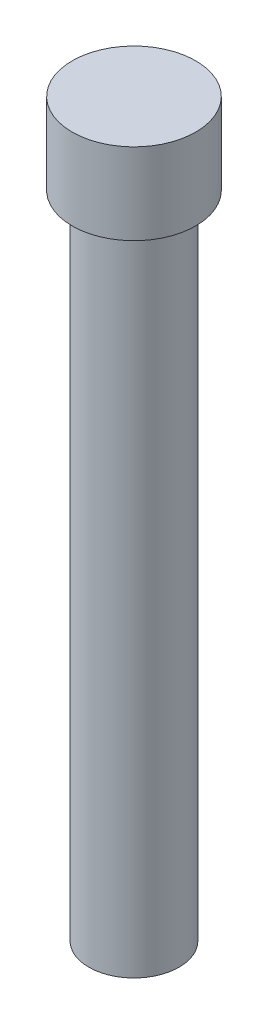
ISO-10303-21;
HEADER;
FILE_DESCRIPTION(('STEP AP214'),'2;1');
FILE_NAME('part.step','',(''),(''),'','','');
FILE_SCHEMA(('AUTOMOTIVE_DESIGN { 1 0 10303 214 1 1 1 1 }'));
ENDSEC;
DATA;
#1=APPLICATION_CONTEXT('core data for automotive mechanical design processes');
#2=APPLICATION_PROTOCOL_DEFINITION('international standard','automotive_design',2000,#1);
#3=PRODUCT_CONTEXT('',#1,'mechanical');
#4=PRODUCT('Part','Part','',(#3));
#5=PRODUCT_RELATED_PRODUCT_CATEGORY('part','',(#4));
#6=PRODUCT_DEFINITION_FORMATION('','',#4);
#7=PRODUCT_DEFINITION_CONTEXT('part definition',#1,'design');
#8=PRODUCT_DEFINITION('design','',#6,#7);
#9=PRODUCT_DEFINITION_SHAPE('','',#8);
#10=(LENGTH_UNIT() NAMED_UNIT(*) SI_UNIT(.MILLI.,.METRE.));
#11=(NAMED_UNIT(*) PLANE_ANGLE_UNIT() SI_UNIT($,.RADIAN.));
#12=(NAMED_UNIT(*) SI_UNIT($,.STERADIAN.) SOLID_ANGLE_UNIT());
#13=UNCERTAINTY_MEASURE_WITH_UNIT(LENGTH_MEASURE(1.E-05),#10,'distance_accuracy_value','');
#14=(GEOMETRIC_REPRESENTATION_CONTEXT(3) GLOBAL_UNCERTAINTY_ASSIGNED_CONTEXT((#13)) GLOBAL_UNIT_ASSIGNED_CONTEXT((#10,
#11,#12)) REPRESENTATION_CONTEXT('',''));
#15=CARTESIAN_POINT('',(0.,0.,0.));
#16=DIRECTION('',(0.,0.,1.));
#17=DIRECTION('',(1.,0.,0.));
#18=AXIS2_PLACEMENT_3D('',#15,#16,#17);
#19=CARTESIAN_POINT('',(0.,25.4,0.));
#20=DIRECTION('',(0.,-1.,0.));
#21=DIRECTION('',(0.,0.,-1.));
#22=AXIS2_PLACEMENT_3D('',#19,#20,#21);
#23=CYLINDRICAL_SURFACE('',#22,1.76403);
#24=CARTESIAN_POINT('',(0.,25.4,0.));
#25=DIRECTION('',(0.,1.,0.));
#26=DIRECTION('',(0.,0.,1.));
#27=AXIS2_PLACEMENT_3D('',#24,#25,#26);
#28=CIRCLE('',#27,1.76403);
#29=CARTESIAN_POINT('',(0.,25.4,1.76403));
#30=VERTEX_POINT('',#29);
#31=EDGE_CURVE('E10',#30,#30,#28,.T.);
#32=ORIENTED_EDGE('',*,*,#31,.F.);
#33=EDGE_LOOP('',(#32));
#34=FACE_BOUND('',#33,.T.);
#35=CARTESIAN_POINT('',(0.,0.,0.));
#36=DIRECTION('',(0.,1.,0.));
#37=DIRECTION('',(0.,0.,1.));
#38=AXIS2_PLACEMENT_3D('',#35,#36,#37);
#39=CIRCLE('',#38,1.76403);
#40=CARTESIAN_POINT('',(0.,0.,1.76403));
#41=VERTEX_POINT('',#40);
#42=EDGE_CURVE('E34',#41,#41,#39,.T.);
#43=ORIENTED_EDGE('',*,*,#42,.T.);
#44=EDGE_LOOP('',(#43));
#45=FACE_BOUND('',#44,.T.);
#46=ADVANCED_FACE('F31',(#34,#45),#23,.T.);
#47=CARTESIAN_POINT('',(0.,0.,0.));
#48=DIRECTION('',(0.,1.,0.));
#49=DIRECTION('',(0.,0.,1.));
#50=AXIS2_PLACEMENT_3D('',#47,#48,#49);
#51=PLANE('',#50);
#52=ORIENTED_EDGE('',*,*,#42,.F.);
#53=EDGE_LOOP('',(#52));
#54=FACE_BOUND('',#53,.T.);
#55=ADVANCED_FACE('F54',(#54),#51,.F.);
#56=CARTESIAN_POINT('',(0.,28.575,0.));
#57=DIRECTION('',(0.,-1.,0.));
#58=DIRECTION('',(0.,0.,-1.));
#59=AXIS2_PLACEMENT_3D('',#56,#57,#58);
#60=CYLINDRICAL_SURFACE('',#59,2.413);
#61=CARTESIAN_POINT('',(0.,28.575,0.));
#62=DIRECTION('',(0.,1.,0.));
#63=DIRECTION('',(0.,0.,1.));
#64=AXIS2_PLACEMENT_3D('',#61,#62,#63);
#65=CIRCLE('',#64,2.413);
#66=CARTESIAN_POINT('',(0.,28.575,2.413));
#67=VERTEX_POINT('',#66);
#68=EDGE_CURVE('E41',#67,#67,#65,.T.);
#69=ORIENTED_EDGE('',*,*,#68,.F.);
#70=EDGE_LOOP('',(#69));
#71=FACE_BOUND('',#70,.T.);
#72=CARTESIAN_POINT('',(0.,25.4,0.));
#73=DIRECTION('',(0.,1.,0.));
#74=DIRECTION('',(0.,0.,1.));
#75=AXIS2_PLACEMENT_3D('',#72,#73,#74);
#76=CIRCLE('',#75,2.413);
#77=CARTESIAN_POINT('',(0.,25.4,2.413));
#78=VERTEX_POINT('',#77);
#79=EDGE_CURVE('E43',#78,#78,#76,.T.);
#80=ORIENTED_EDGE('',*,*,#79,.T.);
#81=EDGE_LOOP('',(#80));
#82=FACE_BOUND('',#81,.T.);
#83=ADVANCED_FACE('F51',(#71,#82),#60,.T.);
#84=CARTESIAN_POINT('',(0.,28.575,0.));
#85=DIRECTION('',(0.,1.,0.));
#86=DIRECTION('',(0.,0.,1.));
#87=AXIS2_PLACEMENT_3D('',#84,#85,#86);
#88=PLANE('',#87);
#89=ORIENTED_EDGE('',*,*,#68,.T.);
#90=EDGE_LOOP('',(#89));
#91=FACE_BOUND('',#90,.T.);
#92=ADVANCED_FACE('F49',(#91),#88,.T.);
#93=CARTESIAN_POINT('',(0.,25.4,0.));
#94=DIRECTION('',(0.,1.,0.));
#95=DIRECTION('',(0.,0.,1.));
#96=AXIS2_PLACEMENT_3D('',#93,#94,#95);
#97=PLANE('',#96);
#98=ORIENTED_EDGE('',*,*,#31,.T.);
#99=EDGE_LOOP('',(#98));
#100=FACE_BOUND('',#99,.T.);
#101=ORIENTED_EDGE('',*,*,#79,.F.);
#102=EDGE_LOOP('',(#101));
#103=FACE_BOUND('',#102,.T.);
#104=ADVANCED_FACE('F58',(#100,#103),#97,.F.);
#105=CLOSED_SHELL('',(#46,#55,#83,#92,#104));
#106=MANIFOLD_SOLID_BREP('B2',#105);
#107=ADVANCED_BREP_SHAPE_REPRESENTATION('',(#18,#106),#14);
#108=SHAPE_DEFINITION_REPRESENTATION(#9,#107);
ENDSEC;
END-ISO-10303-21;
